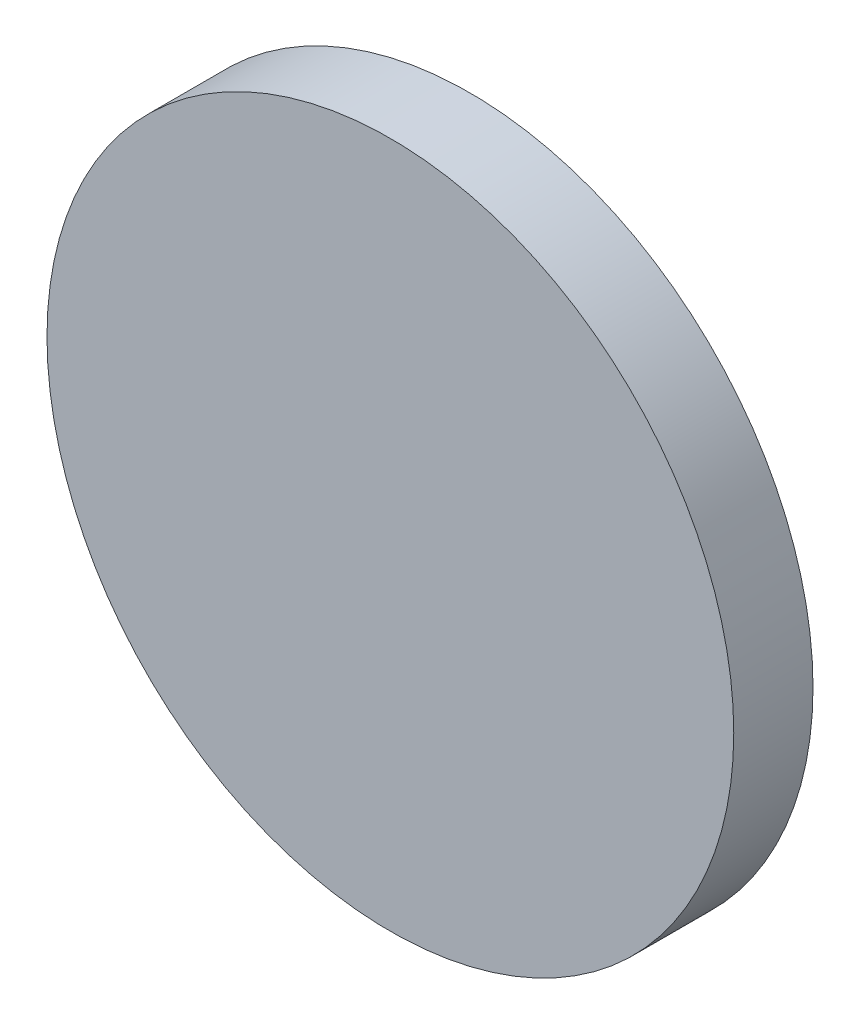
ISO-10303-21;
HEADER;
FILE_DESCRIPTION(('STEP AP214'),'2;1');
FILE_NAME('part.step','',(''),(''),'','','');
FILE_SCHEMA(('AUTOMOTIVE_DESIGN { 1 0 10303 214 1 1 1 1 }'));
ENDSEC;
DATA;
#1=APPLICATION_CONTEXT('core data for automotive mechanical design processes');
#2=APPLICATION_PROTOCOL_DEFINITION('international standard','automotive_design',2000,#1);
#3=PRODUCT_CONTEXT('',#1,'mechanical');
#4=PRODUCT('Part','Part','',(#3));
#5=PRODUCT_RELATED_PRODUCT_CATEGORY('part','',(#4));
#6=PRODUCT_DEFINITION_FORMATION('','',#4);
#7=PRODUCT_DEFINITION_CONTEXT('part definition',#1,'design');
#8=PRODUCT_DEFINITION('design','',#6,#7);
#9=PRODUCT_DEFINITION_SHAPE('','',#8);
#10=(LENGTH_UNIT() NAMED_UNIT(*) SI_UNIT(.MILLI.,.METRE.));
#11=(NAMED_UNIT(*) PLANE_ANGLE_UNIT() SI_UNIT($,.RADIAN.));
#12=(NAMED_UNIT(*) SI_UNIT($,.STERADIAN.) SOLID_ANGLE_UNIT());
#13=UNCERTAINTY_MEASURE_WITH_UNIT(LENGTH_MEASURE(1.E-05),#10,'distance_accuracy_value','');
#14=(GEOMETRIC_REPRESENTATION_CONTEXT(3) GLOBAL_UNCERTAINTY_ASSIGNED_CONTEXT((#13)) GLOBAL_UNIT_ASSIGNED_CONTEXT((#10,
#11,#12)) REPRESENTATION_CONTEXT('',''));
#15=CARTESIAN_POINT('',(0.,0.,0.));
#16=DIRECTION('',(0.,0.,1.));
#17=DIRECTION('',(1.,0.,0.));
#18=AXIS2_PLACEMENT_3D('',#15,#16,#17);
#19=CARTESIAN_POINT('',(0.,0.,9.525));
#20=DIRECTION('',(0.,0.,-1.));
#21=DIRECTION('',(-1.,0.,0.));
#22=AXIS2_PLACEMENT_3D('',#19,#20,#21);
#23=CYLINDRICAL_SURFACE('',#22,41.275);
#24=CARTESIAN_POINT('',(0.,0.,9.525));
#25=DIRECTION('',(0.,0.,1.));
#26=DIRECTION('',(1.,0.,0.));
#27=AXIS2_PLACEMENT_3D('',#24,#25,#26);
#28=CIRCLE('',#27,41.275);
#29=CARTESIAN_POINT('',(-41.275,0.,9.525));
#30=VERTEX_POINT('',#29);
#31=EDGE_CURVE('E10',#30,#30,#28,.T.);
#32=CARTESIAN_POINT('',(0.,0.,0.));
#33=DIRECTION('',(0.,0.,1.));
#34=DIRECTION('',(1.,0.,0.));
#35=AXIS2_PLACEMENT_3D('',#32,#33,#34);
#36=CIRCLE('',#35,41.275);
#37=CARTESIAN_POINT('',(-41.275,0.,0.));
#38=VERTEX_POINT('',#37);
#39=EDGE_CURVE('E37',#38,#38,#36,.T.);
#40=CARTESIAN_POINT('',(-41.275,0.,9.525));
#41=CARTESIAN_POINT('',(-41.275,0.,9.42578125));
#42=CARTESIAN_POINT('',(-41.275,0.,9.3265625));
#43=CARTESIAN_POINT('',(-41.275,0.,9.128125));
#44=CARTESIAN_POINT('',(-41.275,0.,9.02890625));
#45=CARTESIAN_POINT('',(-41.275,0.,8.83046875));
#46=CARTESIAN_POINT('',(-41.275,0.,8.73125));
#47=CARTESIAN_POINT('',(-41.275,0.,8.5328125));
#48=CARTESIAN_POINT('',(-41.275,0.,8.43359375));
#49=CARTESIAN_POINT('',(-41.275,0.,8.23515625));
#50=CARTESIAN_POINT('',(-41.275,0.,8.1359375));
#51=CARTESIAN_POINT('',(-41.275,0.,7.9375));
#52=CARTESIAN_POINT('',(-41.275,0.,7.83828125));
#53=CARTESIAN_POINT('',(-41.275,0.,7.63984375));
#54=CARTESIAN_POINT('',(-41.275,0.,7.540625));
#55=CARTESIAN_POINT('',(-41.275,0.,7.3421875));
#56=CARTESIAN_POINT('',(-41.275,0.,7.24296875));
#57=CARTESIAN_POINT('',(-41.275,0.,7.04453125));
#58=CARTESIAN_POINT('',(-41.275,0.,6.9453125));
#59=CARTESIAN_POINT('',(-41.275,0.,6.746875));
#60=CARTESIAN_POINT('',(-41.275,0.,6.64765625));
#61=CARTESIAN_POINT('',(-41.275,0.,6.44921875));
#62=CARTESIAN_POINT('',(-41.275,0.,6.35));
#63=CARTESIAN_POINT('',(-41.275,0.,6.1515625));
#64=CARTESIAN_POINT('',(-41.275,0.,6.05234375));
#65=CARTESIAN_POINT('',(-41.275,0.,5.85390625));
#66=CARTESIAN_POINT('',(-41.275,0.,5.7546875));
#67=CARTESIAN_POINT('',(-41.275,0.,5.55625));
#68=CARTESIAN_POINT('',(-41.275,0.,5.45703125));
#69=CARTESIAN_POINT('',(-41.275,0.,5.25859375));
#70=CARTESIAN_POINT('',(-41.275,0.,5.159375));
#71=CARTESIAN_POINT('',(-41.275,0.,4.9609375));
#72=CARTESIAN_POINT('',(-41.275,0.,4.86171875));
#73=CARTESIAN_POINT('',(-41.275,0.,4.66328125));
#74=CARTESIAN_POINT('',(-41.275,0.,4.5640625));
#75=CARTESIAN_POINT('',(-41.275,0.,4.365625));
#76=CARTESIAN_POINT('',(-41.275,0.,4.26640625));
#77=CARTESIAN_POINT('',(-41.275,0.,4.06796875));
#78=CARTESIAN_POINT('',(-41.275,0.,3.96875));
#79=CARTESIAN_POINT('',(-41.275,0.,3.7703125));
#80=CARTESIAN_POINT('',(-41.275,0.,3.67109375));
#81=CARTESIAN_POINT('',(-41.275,0.,3.47265625));
#82=CARTESIAN_POINT('',(-41.275,0.,3.3734375));
#83=CARTESIAN_POINT('',(-41.275,0.,3.175));
#84=CARTESIAN_POINT('',(-41.275,0.,3.07578125));
#85=CARTESIAN_POINT('',(-41.275,0.,2.87734375));
#86=CARTESIAN_POINT('',(-41.275,0.,2.778125));
#87=CARTESIAN_POINT('',(-41.275,0.,2.5796875));
#88=CARTESIAN_POINT('',(-41.275,0.,2.48046875));
#89=CARTESIAN_POINT('',(-41.275,0.,2.28203125));
#90=CARTESIAN_POINT('',(-41.275,0.,2.1828125));
#91=CARTESIAN_POINT('',(-41.275,0.,1.984375));
#92=CARTESIAN_POINT('',(-41.275,0.,1.88515625));
#93=CARTESIAN_POINT('',(-41.275,0.,1.68671875));
#94=CARTESIAN_POINT('',(-41.275,0.,1.5875));
#95=CARTESIAN_POINT('',(-41.275,0.,1.3890625));
#96=CARTESIAN_POINT('',(-41.275,0.,1.28984375));
#97=CARTESIAN_POINT('',(-41.275,0.,1.09140625));
#98=CARTESIAN_POINT('',(-41.275,0.,0.992187500000001));
#99=CARTESIAN_POINT('',(-41.275,0.,0.793750000000001));
#100=CARTESIAN_POINT('',(-41.275,0.,0.69453125));
#101=CARTESIAN_POINT('',(-41.275,0.,0.49609375));
#102=CARTESIAN_POINT('',(-41.275,0.,0.396875));
#103=CARTESIAN_POINT('',(-41.275,0.,0.1984375));
#104=CARTESIAN_POINT('',(-41.275,0.,0.0992187500000001));
#105=CARTESIAN_POINT('',(-41.275,0.,0.));
#106=B_SPLINE_CURVE_WITH_KNOTS('',3,(#40,#41,#42,#43,#44,#45,#46,#47,#48,#49,#50,#51,#52,#53,
#54,#55,#56,#57,#58,#59,#60,#61,#62,#63,#64,#65,#66,#67,#68,#69,#70,#71,#72,#73,#74,#75,#76,#77,
#78,#79,#80,#81,#82,#83,#84,#85,#86,#87,#88,#89,#90,#91,#92,#93,#94,#95,#96,#97,#98,#99,#100,
#101,#102,#103,#104,#105),.UNSPECIFIED.,.F.,.F.,(4,2,2,2,2,2,2,2,2,2,2,2,2,2,2,2,2,2,2,2,2,2,2,
2,2,2,2,2,2,2,2,2,4),(0.,0.297656249999998,0.595312499999999,0.892968749999999,1.190625,
1.48828125,1.7859375,2.08359375,2.38125,2.67890625,2.9765625,3.27421875,3.571875,3.86953125,
4.1671875,4.46484375,4.7625,5.06015625,5.3578125,5.65546875,5.953125,6.25078125,6.5484375,
6.84609375,7.14375,7.44140625,7.7390625,8.03671875,8.334375,8.63203125,8.9296875,9.22734375,
9.525),.UNSPECIFIED.);
#107=EDGE_CURVE('BSEAM40',#30,#38,#106,.T.);
#108=ORIENTED_EDGE('',*,*,#31,.F.);
#109=ORIENTED_EDGE('',*,*,#39,.T.);
#110=ORIENTED_EDGE('',*,*,#107,.T.);
#111=ORIENTED_EDGE('',*,*,#107,.F.);
#112=EDGE_LOOP('',(#108,#110,#109,#111));
#113=FACE_BOUND('',#112,.T.);
#114=ADVANCED_FACE('F40',(#113),#23,.T.);
#115=CARTESIAN_POINT('',(0.,0.,9.525));
#116=DIRECTION('',(0.,0.,1.));
#117=DIRECTION('',(1.,0.,0.));
#118=AXIS2_PLACEMENT_3D('',#115,#116,#117);
#119=PLANE('',#118);
#120=ORIENTED_EDGE('',*,*,#31,.T.);
#121=EDGE_LOOP('',(#120));
#122=FACE_BOUND('',#121,.T.);
#123=ADVANCED_FACE('F55',(#122),#119,.T.);
#124=CARTESIAN_POINT('',(0.,0.,0.));
#125=DIRECTION('',(0.,0.,1.));
#126=DIRECTION('',(1.,0.,0.));
#127=AXIS2_PLACEMENT_3D('',#124,#125,#126);
#128=PLANE('',#127);
#129=ORIENTED_EDGE('',*,*,#39,.F.);
#130=EDGE_LOOP('',(#129));
#131=FACE_BOUND('',#130,.T.);
#132=ADVANCED_FACE('F49',(#131),#128,.F.);
#133=CLOSED_SHELL('',(#114,#123,#132));
#134=MANIFOLD_SOLID_BREP('B2',#133);
#135=ADVANCED_BREP_SHAPE_REPRESENTATION('',(#18,#134),#14);
#136=SHAPE_DEFINITION_REPRESENTATION(#9,#135);
ENDSEC;
END-ISO-10303-21;
